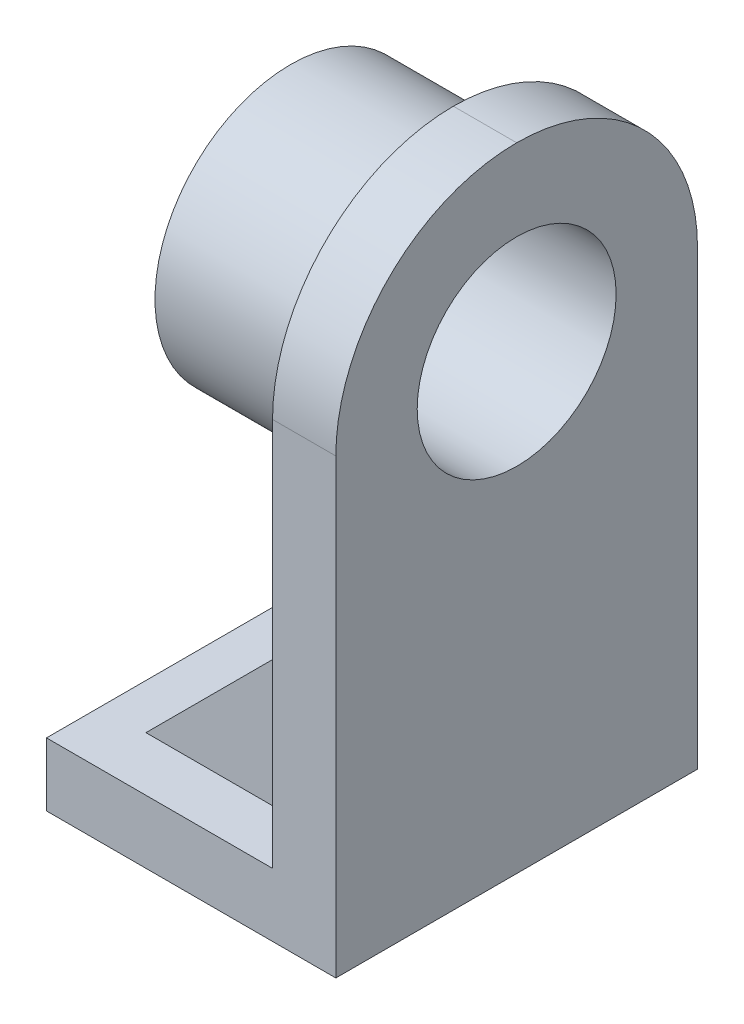
ISO-10303-21;
HEADER;
FILE_DESCRIPTION(('STEP AP214'),'2;1');
FILE_NAME('part.step','',(''),(''),'','','');
FILE_SCHEMA(('AUTOMOTIVE_DESIGN { 1 0 10303 214 1 1 1 1 }'));
ENDSEC;
DATA;
#1=APPLICATION_CONTEXT('core data for automotive mechanical design processes');
#2=APPLICATION_PROTOCOL_DEFINITION('international standard','automotive_design',2000,#1);
#3=PRODUCT_CONTEXT('',#1,'mechanical');
#4=PRODUCT('Part','Part','',(#3));
#5=PRODUCT_RELATED_PRODUCT_CATEGORY('part','',(#4));
#6=PRODUCT_DEFINITION_FORMATION('','',#4);
#7=PRODUCT_DEFINITION_CONTEXT('part definition',#1,'design');
#8=PRODUCT_DEFINITION('design','',#6,#7);
#9=PRODUCT_DEFINITION_SHAPE('','',#8);
#10=(LENGTH_UNIT() NAMED_UNIT(*) SI_UNIT(.MILLI.,.METRE.));
#11=(NAMED_UNIT(*) PLANE_ANGLE_UNIT() SI_UNIT($,.RADIAN.));
#12=(NAMED_UNIT(*) SI_UNIT($,.STERADIAN.) SOLID_ANGLE_UNIT());
#13=UNCERTAINTY_MEASURE_WITH_UNIT(LENGTH_MEASURE(1.E-05),#10,'distance_accuracy_value','');
#14=(GEOMETRIC_REPRESENTATION_CONTEXT(3) GLOBAL_UNCERTAINTY_ASSIGNED_CONTEXT((#13)) GLOBAL_UNIT_ASSIGNED_CONTEXT((#10,
#11,#12)) REPRESENTATION_CONTEXT('',''));
#15=CARTESIAN_POINT('',(0.,0.,0.));
#16=DIRECTION('',(0.,0.,1.));
#17=DIRECTION('',(1.,0.,0.));
#18=AXIS2_PLACEMENT_3D('',#15,#16,#17);
#19=CARTESIAN_POINT('',(-27.,7.,-30.));
#20=DIRECTION('',(-0.707106781186548,0.707106781186548,0.));
#21=DIRECTION('',(-0.707106781186548,-0.707106781186548,0.));
#22=AXIS2_PLACEMENT_3D('',#19,#20,#21);
#23=PLANE('',#22);
#24=DIRECTION('',(0.,0.,-1.));
#25=VECTOR('',#24,1.);
#26=CARTESIAN_POINT('',(-7.,27.,-30.));
#27=LINE('',#26,#25);
#28=CARTESIAN_POINT('',(-7.,27.,-30.));
#29=VERTEX_POINT('',#28);
#30=CARTESIAN_POINT('',(-7.,27.,-34.));
#31=VERTEX_POINT('',#30);
#32=EDGE_CURVE('E158',#29,#31,#27,.T.);
#33=ORIENTED_EDGE('',*,*,#32,.T.);
#34=DIRECTION('',(0.707106781186548,0.707106781186548,0.));
#35=VECTOR('',#34,1.);
#36=CARTESIAN_POINT('',(-7.,27.,-34.));
#37=LINE('',#36,#35);
#38=CARTESIAN_POINT('',(-27.,7.,-34.));
#39=VERTEX_POINT('',#38);
#40=EDGE_CURVE('E138',#39,#31,#37,.T.);
#41=ORIENTED_EDGE('',*,*,#40,.F.);
#42=DIRECTION('',(0.,0.,-1.));
#43=VECTOR('',#42,1.);
#44=CARTESIAN_POINT('',(-27.,7.,-30.));
#45=LINE('',#44,#43);
#46=CARTESIAN_POINT('',(-27.,7.,-30.));
#47=VERTEX_POINT('',#46);
#48=EDGE_CURVE('E141',#47,#39,#45,.T.);
#49=ORIENTED_EDGE('',*,*,#48,.F.);
#50=DIRECTION('',(0.707106781186548,0.707106781186548,0.));
#51=VECTOR('',#50,1.);
#52=CARTESIAN_POINT('',(-27.,7.,-30.));
#53=LINE('',#52,#51);
#54=EDGE_CURVE('E137',#47,#29,#53,.T.);
#55=ORIENTED_EDGE('',*,*,#54,.T.);
#56=EDGE_LOOP('',(#33,#41,#49,#55));
#57=FACE_BOUND('',#56,.T.);
#58=ADVANCED_FACE('F33',(#57),#23,.T.);
#59=CARTESIAN_POINT('',(-32.,7.,-40.));
#60=DIRECTION('',(0.,1.,0.));
#61=DIRECTION('',(0.,0.,1.));
#62=AXIS2_PLACEMENT_3D('',#59,#60,#61);
#63=PLANE('',#62);
#64=ORIENTED_EDGE('',*,*,#48,.T.);
#65=DIRECTION('',(-1.,0.,0.));
#66=VECTOR('',#65,1.);
#67=CARTESIAN_POINT('',(-27.,7.,-34.));
#68=LINE('',#67,#66);
#69=CARTESIAN_POINT('',(-7.,7.,-34.));
#70=VERTEX_POINT('',#69);
#71=EDGE_CURVE('E49',#70,#39,#68,.T.);
#72=ORIENTED_EDGE('',*,*,#71,.F.);
#73=DIRECTION('',(0.,0.,-1.));
#74=VECTOR('',#73,1.);
#75=CARTESIAN_POINT('',(-7.,7.,-34.));
#76=LINE('',#75,#74);
#77=CARTESIAN_POINT('',(-7.,7.,-40.));
#78=VERTEX_POINT('',#77);
#79=EDGE_CURVE('E131',#70,#78,#76,.T.);
#80=ORIENTED_EDGE('',*,*,#79,.T.);
#81=DIRECTION('',(-1.,0.,0.));
#82=VECTOR('',#81,1.);
#83=CARTESIAN_POINT('',(-32.,7.,-40.));
#84=LINE('',#83,#82);
#85=CARTESIAN_POINT('',(-32.,7.,-40.));
#86=VERTEX_POINT('',#85);
#87=EDGE_CURVE('E191',#78,#86,#84,.T.);
#88=ORIENTED_EDGE('',*,*,#87,.T.);
#89=DIRECTION('',(0.,0.,1.));
#90=VECTOR('',#89,1.);
#91=CARTESIAN_POINT('',(-32.,7.,-40.));
#92=LINE('',#91,#90);
#93=CARTESIAN_POINT('',(-32.,7.,0.));
#94=VERTEX_POINT('',#93);
#95=EDGE_CURVE('E217',#86,#94,#92,.T.);
#96=ORIENTED_EDGE('',*,*,#95,.T.);
#97=DIRECTION('',(-1.,0.,0.));
#98=VECTOR('',#97,1.);
#99=CARTESIAN_POINT('',(-32.,7.,0.));
#100=LINE('',#99,#98);
#101=CARTESIAN_POINT('',(-7.,7.,0.));
#102=VERTEX_POINT('',#101);
#103=EDGE_CURVE('E205',#102,#94,#100,.T.);
#104=ORIENTED_EDGE('',*,*,#103,.F.);
#105=DIRECTION('',(0.,0.,1.));
#106=VECTOR('',#105,1.);
#107=CARTESIAN_POINT('',(-7.,7.,-6.));
#108=LINE('',#107,#106);
#109=CARTESIAN_POINT('',(-7.,7.,-6.));
#110=VERTEX_POINT('',#109);
#111=EDGE_CURVE('E169',#110,#102,#108,.T.);
#112=ORIENTED_EDGE('',*,*,#111,.F.);
#113=DIRECTION('',(1.,0.,0.));
#114=VECTOR('',#113,1.);
#115=CARTESIAN_POINT('',(-7.,7.,-6.));
#116=LINE('',#115,#114);
#117=CARTESIAN_POINT('',(-27.,7.,-6.));
#118=VERTEX_POINT('',#117);
#119=EDGE_CURVE('E164',#118,#110,#116,.T.);
#120=ORIENTED_EDGE('',*,*,#119,.F.);
#121=DIRECTION('',(0.,0.,1.));
#122=VECTOR('',#121,1.);
#123=CARTESIAN_POINT('',(-27.,7.,-10.));
#124=LINE('',#123,#122);
#125=CARTESIAN_POINT('',(-27.,7.,-10.));
#126=VERTEX_POINT('',#125);
#127=EDGE_CURVE('E183',#126,#118,#124,.T.);
#128=ORIENTED_EDGE('',*,*,#127,.F.);
#129=DIRECTION('',(-1.,0.,0.));
#130=VECTOR('',#129,1.);
#131=CARTESIAN_POINT('',(-7.,7.,-10.));
#132=LINE('',#131,#130);
#133=CARTESIAN_POINT('',(-7.,7.,-10.));
#134=VERTEX_POINT('',#133);
#135=EDGE_CURVE('E172',#134,#126,#132,.T.);
#136=ORIENTED_EDGE('',*,*,#135,.F.);
#137=DIRECTION('',(0.,0.,1.));
#138=VECTOR('',#137,1.);
#139=CARTESIAN_POINT('',(-7.,7.,-40.));
#140=LINE('',#139,#138);
#141=CARTESIAN_POINT('',(-7.,7.,-30.));
#142=VERTEX_POINT('',#141);
#143=EDGE_CURVE('E199',#142,#134,#140,.T.);
#144=ORIENTED_EDGE('',*,*,#143,.F.);
#145=DIRECTION('',(-1.,0.,0.));
#146=VECTOR('',#145,1.);
#147=CARTESIAN_POINT('',(-7.,7.,-30.));
#148=LINE('',#147,#146);
#149=EDGE_CURVE('E57',#142,#47,#148,.T.);
#150=ORIENTED_EDGE('',*,*,#149,.T.);
#151=EDGE_LOOP('',(#64,#72,#80,#88,#96,#104,#112,#120,#128,#136,#144,#150));
#152=FACE_BOUND('',#151,.T.);
#153=ADVANCED_FACE('F140',(#152),#63,.T.);
#154=CARTESIAN_POINT('',(-7.,7.,-40.));
#155=DIRECTION('',(-1.,0.,0.));
#156=DIRECTION('',(0.,-1.,0.));
#157=AXIS2_PLACEMENT_3D('',#154,#155,#156);
#158=PLANE('',#157);
#159=CARTESIAN_POINT('',(-7.,50.,-20.));
#160=DIRECTION('',(-1.,0.,0.));
#161=DIRECTION('',(0.,-1.,0.));
#162=AXIS2_PLACEMENT_3D('',#159,#160,#161);
#163=CIRCLE('',#162,15.);
#164=CARTESIAN_POINT('',(-7.,35.,-20.));
#165=VERTEX_POINT('',#164);
#166=EDGE_CURVE('E148',#165,#165,#163,.T.);
#167=ORIENTED_EDGE('',*,*,#166,.F.);
#168=EDGE_LOOP('',(#167));
#169=FACE_BOUND('',#168,.T.);
#170=ORIENTED_EDGE('',*,*,#32,.F.);
#171=DIRECTION('',(0.,-1.,0.));
#172=VECTOR('',#171,1.);
#173=CARTESIAN_POINT('',(-7.,27.,-30.));
#174=LINE('',#173,#172);
#175=EDGE_CURVE('E155',#29,#142,#174,.T.);
#176=ORIENTED_EDGE('',*,*,#175,.T.);
#177=ORIENTED_EDGE('',*,*,#143,.T.);
#178=DIRECTION('',(0.,-1.,0.));
#179=VECTOR('',#178,1.);
#180=CARTESIAN_POINT('',(-7.,27.,-10.));
#181=LINE('',#180,#179);
#182=CARTESIAN_POINT('',(-7.,27.,-10.));
#183=VERTEX_POINT('',#182);
#184=EDGE_CURVE('E177',#183,#134,#181,.T.);
#185=ORIENTED_EDGE('',*,*,#184,.F.);
#186=DIRECTION('',(0.,0.,1.));
#187=VECTOR('',#186,1.);
#188=CARTESIAN_POINT('',(-7.,27.,-10.));
#189=LINE('',#188,#187);
#190=CARTESIAN_POINT('',(-7.,27.,-6.));
#191=VERTEX_POINT('',#190);
#192=EDGE_CURVE('E180',#183,#191,#189,.T.);
#193=ORIENTED_EDGE('',*,*,#192,.T.);
#194=DIRECTION('',(0.,1.,0.));
#195=VECTOR('',#194,1.);
#196=CARTESIAN_POINT('',(-7.,27.,-6.));
#197=LINE('',#196,#195);
#198=EDGE_CURVE('E167',#110,#191,#197,.T.);
#199=ORIENTED_EDGE('',*,*,#198,.F.);
#200=ORIENTED_EDGE('',*,*,#111,.T.);
#201=DIRECTION('',(0.,-1.,0.));
#202=VECTOR('',#201,1.);
#203=CARTESIAN_POINT('',(-7.,7.,0.));
#204=LINE('',#203,#202);
#205=CARTESIAN_POINT('',(-7.,50.,0.));
#206=VERTEX_POINT('',#205);
#207=EDGE_CURVE('E203',#206,#102,#204,.T.);
#208=ORIENTED_EDGE('',*,*,#207,.F.);
#209=CARTESIAN_POINT('',(-7.,50.,-20.));
#210=DIRECTION('',(-1.,0.,0.));
#211=DIRECTION('',(0.,-1.,0.));
#212=AXIS2_PLACEMENT_3D('',#209,#210,#211);
#213=CIRCLE('',#212,20.);
#214=CARTESIAN_POINT('',(-7.,70.,-20.));
#215=VERTEX_POINT('',#214);
#216=EDGE_CURVE('E225',#206,#215,#213,.T.);
#217=ORIENTED_EDGE('',*,*,#216,.T.);
#218=CARTESIAN_POINT('',(-7.,50.,-20.));
#219=DIRECTION('',(-1.,0.,0.));
#220=DIRECTION('',(0.,-1.,0.));
#221=AXIS2_PLACEMENT_3D('',#218,#219,#220);
#222=CIRCLE('',#221,20.);
#223=CARTESIAN_POINT('',(-7.,50.,-40.));
#224=VERTEX_POINT('',#223);
#225=EDGE_CURVE('E223',#215,#224,#222,.T.);
#226=ORIENTED_EDGE('',*,*,#225,.T.);
#227=DIRECTION('',(0.,-1.,0.));
#228=VECTOR('',#227,1.);
#229=CARTESIAN_POINT('',(-7.,7.,-40.));
#230=LINE('',#229,#228);
#231=EDGE_CURVE('E135',#224,#78,#230,.T.);
#232=ORIENTED_EDGE('',*,*,#231,.T.);
#233=ORIENTED_EDGE('',*,*,#79,.F.);
#234=DIRECTION('',(0.,-1.,0.));
#235=VECTOR('',#234,1.);
#236=CARTESIAN_POINT('',(-7.,7.,-34.));
#237=LINE('',#236,#235);
#238=EDGE_CURVE('E133',#31,#70,#237,.T.);
#239=ORIENTED_EDGE('',*,*,#238,.F.);
#240=EDGE_LOOP('',(#170,#176,#177,#185,#193,#199,#200,#208,#217,#226,#232,#233,#239));
#241=FACE_BOUND('',#240,.T.);
#242=ADVANCED_FACE('F132',(#169,#241),#158,.T.);
#243=CARTESIAN_POINT('',(0.,0.,-40.));
#244=DIRECTION('',(1.,0.,0.));
#245=DIRECTION('',(0.,0.,-1.));
#246=AXIS2_PLACEMENT_3D('',#243,#244,#245);
#247=PLANE('',#246);
#248=CARTESIAN_POINT('',(0.,50.,-20.));
#249=DIRECTION('',(-1.,0.,0.));
#250=DIRECTION('',(0.,-1.,0.));
#251=AXIS2_PLACEMENT_3D('',#248,#249,#250);
#252=CIRCLE('',#251,11.);
#253=CARTESIAN_POINT('',(0.,39.,-20.));
#254=VERTEX_POINT('',#253);
#255=EDGE_CURVE('E452',#254,#254,#252,.T.);
#256=ORIENTED_EDGE('',*,*,#255,.T.);
#257=EDGE_LOOP('',(#256));
#258=FACE_BOUND('',#257,.T.);
#259=CARTESIAN_POINT('',(0.,50.,-20.));
#260=DIRECTION('',(1.,0.,0.));
#261=DIRECTION('',(0.,0.,-1.));
#262=AXIS2_PLACEMENT_3D('',#259,#260,#261);
#263=CIRCLE('',#262,20.);
#264=CARTESIAN_POINT('',(0.,50.,-40.));
#265=VERTEX_POINT('',#264);
#266=CARTESIAN_POINT('',(0.,70.,-20.));
#267=VERTEX_POINT('',#266);
#268=EDGE_CURVE('E227',#265,#267,#263,.T.);
#269=ORIENTED_EDGE('',*,*,#268,.T.);
#270=CARTESIAN_POINT('',(0.,50.,-20.));
#271=DIRECTION('',(1.,0.,0.));
#272=DIRECTION('',(0.,0.,-1.));
#273=AXIS2_PLACEMENT_3D('',#270,#271,#272);
#274=CIRCLE('',#273,20.);
#275=CARTESIAN_POINT('',(0.,50.,0.));
#276=VERTEX_POINT('',#275);
#277=EDGE_CURVE('E42',#267,#276,#274,.T.);
#278=ORIENTED_EDGE('',*,*,#277,.T.);
#279=DIRECTION('',(0.,1.,0.));
#280=VECTOR('',#279,1.);
#281=CARTESIAN_POINT('',(0.,0.,0.));
#282=LINE('',#281,#280);
#283=CARTESIAN_POINT('',(0.,0.,0.));
#284=VERTEX_POINT('',#283);
#285=EDGE_CURVE('E200',#284,#276,#282,.T.);
#286=ORIENTED_EDGE('',*,*,#285,.F.);
#287=DIRECTION('',(0.,0.,1.));
#288=VECTOR('',#287,1.);
#289=CARTESIAN_POINT('',(0.,0.,-40.));
#290=LINE('',#289,#288);
#291=CARTESIAN_POINT('',(0.,0.,-40.));
#292=VERTEX_POINT('',#291);
#293=EDGE_CURVE('E212',#292,#284,#290,.T.);
#294=ORIENTED_EDGE('',*,*,#293,.F.);
#295=DIRECTION('',(0.,1.,0.));
#296=VECTOR('',#295,1.);
#297=CARTESIAN_POINT('',(0.,0.,-40.));
#298=LINE('',#297,#296);
#299=EDGE_CURVE('E186',#292,#265,#298,.T.);
#300=ORIENTED_EDGE('',*,*,#299,.T.);
#301=EDGE_LOOP('',(#269,#278,#286,#294,#300));
#302=FACE_BOUND('',#301,.T.);
#303=ADVANCED_FACE('F232',(#258,#302),#247,.T.);
#304=CARTESIAN_POINT('',(0.,0.,-40.));
#305=DIRECTION('',(0.,-1.,0.));
#306=DIRECTION('',(0.,0.,-1.));
#307=AXIS2_PLACEMENT_3D('',#304,#305,#306);
#308=PLANE('',#307);
#309=DIRECTION('',(1.,0.,0.));
#310=VECTOR('',#309,1.);
#311=CARTESIAN_POINT('',(0.,0.,0.));
#312=LINE('',#311,#310);
#313=CARTESIAN_POINT('',(-32.,0.,0.));
#314=VERTEX_POINT('',#313);
#315=EDGE_CURVE('E189',#314,#284,#312,.T.);
#316=ORIENTED_EDGE('',*,*,#315,.F.);
#317=DIRECTION('',(0.,0.,1.));
#318=VECTOR('',#317,1.);
#319=CARTESIAN_POINT('',(-32.,0.,-40.));
#320=LINE('',#319,#318);
#321=CARTESIAN_POINT('',(-32.,0.,-40.));
#322=VERTEX_POINT('',#321);
#323=EDGE_CURVE('E215',#322,#314,#320,.T.);
#324=ORIENTED_EDGE('',*,*,#323,.F.);
#325=DIRECTION('',(1.,0.,0.));
#326=VECTOR('',#325,1.);
#327=CARTESIAN_POINT('',(0.,0.,-40.));
#328=LINE('',#327,#326);
#329=EDGE_CURVE('E196',#322,#292,#328,.T.);
#330=ORIENTED_EDGE('',*,*,#329,.T.);
#331=ORIENTED_EDGE('',*,*,#293,.T.);
#332=EDGE_LOOP('',(#316,#324,#330,#331));
#333=FACE_BOUND('',#332,.T.);
#334=ADVANCED_FACE('F251',(#333),#308,.T.);
#335=CARTESIAN_POINT('',(-32.,0.,-40.));
#336=DIRECTION('',(-1.,0.,0.));
#337=DIRECTION('',(0.,0.,1.));
#338=AXIS2_PLACEMENT_3D('',#335,#336,#337);
#339=PLANE('',#338);
#340=DIRECTION('',(0.,-1.,0.));
#341=VECTOR('',#340,1.);
#342=CARTESIAN_POINT('',(-32.,0.,0.));
#343=LINE('',#342,#341);
#344=EDGE_CURVE('E207',#94,#314,#343,.T.);
#345=ORIENTED_EDGE('',*,*,#344,.F.);
#346=ORIENTED_EDGE('',*,*,#95,.F.);
#347=DIRECTION('',(0.,-1.,0.));
#348=VECTOR('',#347,1.);
#349=CARTESIAN_POINT('',(-32.,0.,-40.));
#350=LINE('',#349,#348);
#351=EDGE_CURVE('E193',#86,#322,#350,.T.);
#352=ORIENTED_EDGE('',*,*,#351,.T.);
#353=ORIENTED_EDGE('',*,*,#323,.T.);
#354=EDGE_LOOP('',(#345,#346,#352,#353));
#355=FACE_BOUND('',#354,.T.);
#356=ADVANCED_FACE('F256',(#355),#339,.T.);
#357=CARTESIAN_POINT('',(0.,0.,-40.));
#358=DIRECTION('',(0.,0.,-1.));
#359=DIRECTION('',(-1.,0.,0.));
#360=AXIS2_PLACEMENT_3D('',#357,#358,#359);
#361=PLANE('',#360);
#362=ORIENTED_EDGE('',*,*,#87,.F.);
#363=ORIENTED_EDGE('',*,*,#231,.F.);
#364=DIRECTION('',(-1.,0.,0.));
#365=VECTOR('',#364,1.);
#366=CARTESIAN_POINT('',(0.,50.,-40.));
#367=LINE('',#366,#365);
#368=EDGE_CURVE('E11',#224,#265,#367,.F.);
#369=ORIENTED_EDGE('',*,*,#368,.T.);
#370=ORIENTED_EDGE('',*,*,#299,.F.);
#371=ORIENTED_EDGE('',*,*,#329,.F.);
#372=ORIENTED_EDGE('',*,*,#351,.F.);
#373=EDGE_LOOP('',(#362,#363,#369,#370,#371,#372));
#374=FACE_BOUND('',#373,.T.);
#375=ADVANCED_FACE('F248',(#374),#361,.T.);
#376=CARTESIAN_POINT('',(0.,0.,0.));
#377=DIRECTION('',(0.,0.,-1.));
#378=DIRECTION('',(-1.,0.,0.));
#379=AXIS2_PLACEMENT_3D('',#376,#377,#378);
#380=PLANE('',#379);
#381=ORIENTED_EDGE('',*,*,#207,.T.);
#382=ORIENTED_EDGE('',*,*,#103,.T.);
#383=ORIENTED_EDGE('',*,*,#344,.T.);
#384=ORIENTED_EDGE('',*,*,#315,.T.);
#385=ORIENTED_EDGE('',*,*,#285,.T.);
#386=DIRECTION('',(-1.,0.,0.));
#387=VECTOR('',#386,1.);
#388=CARTESIAN_POINT('',(-7.,50.,0.));
#389=LINE('',#388,#387);
#390=EDGE_CURVE('E214',#276,#206,#389,.T.);
#391=ORIENTED_EDGE('',*,*,#390,.T.);
#392=EDGE_LOOP('',(#381,#382,#383,#384,#385,#391));
#393=FACE_BOUND('',#392,.T.);
#394=ADVANCED_FACE('F239',(#393),#380,.F.);
#395=CARTESIAN_POINT('',(-7.,50.,-20.));
#396=DIRECTION('',(-1.,0.,0.));
#397=DIRECTION('',(0.,0.,1.));
#398=AXIS2_PLACEMENT_3D('',#395,#396,#397);
#399=CYLINDRICAL_SURFACE('',#398,20.);
#400=DIRECTION('',(-1.,0.,0.));
#401=VECTOR('',#400,1.);
#402=CARTESIAN_POINT('',(-7.,70.,-20.));
#403=LINE('',#402,#401);
#404=EDGE_CURVE('E37',#267,#215,#403,.T.);
#405=ORIENTED_EDGE('',*,*,#404,.F.);
#406=ORIENTED_EDGE('',*,*,#268,.F.);
#407=ORIENTED_EDGE('',*,*,#368,.F.);
#408=ORIENTED_EDGE('',*,*,#225,.F.);
#409=EDGE_LOOP('',(#405,#406,#407,#408));
#410=FACE_BOUND('',#409,.T.);
#411=ADVANCED_FACE('F35',(#410),#399,.T.);
#412=CARTESIAN_POINT('',(0.,50.,-20.));
#413=DIRECTION('',(1.,0.,0.));
#414=DIRECTION('',(0.,0.,-1.));
#415=AXIS2_PLACEMENT_3D('',#412,#413,#414);
#416=CYLINDRICAL_SURFACE('',#415,20.);
#417=ORIENTED_EDGE('',*,*,#277,.F.);
#418=ORIENTED_EDGE('',*,*,#404,.T.);
#419=ORIENTED_EDGE('',*,*,#216,.F.);
#420=ORIENTED_EDGE('',*,*,#390,.F.);
#421=EDGE_LOOP('',(#417,#418,#419,#420));
#422=FACE_BOUND('',#421,.T.);
#423=ADVANCED_FACE('F242',(#422),#416,.T.);
#424=CARTESIAN_POINT('',(-27.,7.,-10.));
#425=DIRECTION('',(0.707106781186548,-0.707106781186548,0.));
#426=DIRECTION('',(0.707106781186548,0.707106781186548,0.));
#427=AXIS2_PLACEMENT_3D('',#424,#425,#426);
#428=PLANE('',#427);
#429=ORIENTED_EDGE('',*,*,#127,.T.);
#430=DIRECTION('',(-0.707106781186548,-0.707106781186548,0.));
#431=VECTOR('',#430,1.);
#432=CARTESIAN_POINT('',(-27.,7.,-6.));
#433=LINE('',#432,#431);
#434=EDGE_CURVE('E160',#191,#118,#433,.T.);
#435=ORIENTED_EDGE('',*,*,#434,.F.);
#436=ORIENTED_EDGE('',*,*,#192,.F.);
#437=DIRECTION('',(0.707106781186548,0.707106781186548,0.));
#438=VECTOR('',#437,1.);
#439=CARTESIAN_POINT('',(-27.,7.,-10.));
#440=LINE('',#439,#438);
#441=EDGE_CURVE('E175',#126,#183,#440,.T.);
#442=ORIENTED_EDGE('',*,*,#441,.F.);
#443=EDGE_LOOP('',(#429,#435,#436,#442));
#444=FACE_BOUND('',#443,.T.);
#445=ADVANCED_FACE('F265',(#444),#428,.F.);
#446=CARTESIAN_POINT('',(0.,0.,-10.));
#447=DIRECTION('',(0.,0.,1.));
#448=DIRECTION('',(1.,0.,0.));
#449=AXIS2_PLACEMENT_3D('',#446,#447,#448);
#450=PLANE('',#449);
#451=ORIENTED_EDGE('',*,*,#135,.T.);
#452=ORIENTED_EDGE('',*,*,#441,.T.);
#453=ORIENTED_EDGE('',*,*,#184,.T.);
#454=EDGE_LOOP('',(#451,#452,#453));
#455=FACE_BOUND('',#454,.T.);
#456=ADVANCED_FACE('F269',(#455),#450,.F.);
#457=CARTESIAN_POINT('',(0.,0.,-6.));
#458=DIRECTION('',(0.,0.,-1.));
#459=DIRECTION('',(-1.,0.,0.));
#460=AXIS2_PLACEMENT_3D('',#457,#458,#459);
#461=PLANE('',#460);
#462=ORIENTED_EDGE('',*,*,#434,.T.);
#463=ORIENTED_EDGE('',*,*,#119,.T.);
#464=ORIENTED_EDGE('',*,*,#198,.T.);
#465=EDGE_LOOP('',(#462,#463,#464));
#466=FACE_BOUND('',#465,.T.);
#467=ADVANCED_FACE('F263',(#466),#461,.F.);
#468=CARTESIAN_POINT('',(0.,0.,-30.));
#469=DIRECTION('',(0.,0.,-1.));
#470=DIRECTION('',(-1.,0.,0.));
#471=AXIS2_PLACEMENT_3D('',#468,#469,#470);
#472=PLANE('',#471);
#473=ORIENTED_EDGE('',*,*,#54,.F.);
#474=ORIENTED_EDGE('',*,*,#149,.F.);
#475=ORIENTED_EDGE('',*,*,#175,.F.);
#476=EDGE_LOOP('',(#473,#474,#475));
#477=FACE_BOUND('',#476,.T.);
#478=ADVANCED_FACE('F273',(#477),#472,.F.);
#479=CARTESIAN_POINT('',(0.,0.,-34.));
#480=DIRECTION('',(0.,0.,-1.));
#481=DIRECTION('',(-1.,0.,0.));
#482=AXIS2_PLACEMENT_3D('',#479,#480,#481);
#483=PLANE('',#482);
#484=ORIENTED_EDGE('',*,*,#238,.T.);
#485=ORIENTED_EDGE('',*,*,#71,.T.);
#486=ORIENTED_EDGE('',*,*,#40,.T.);
#487=EDGE_LOOP('',(#484,#485,#486));
#488=FACE_BOUND('',#487,.T.);
#489=ADVANCED_FACE('F143',(#488),#483,.T.);
#490=CARTESIAN_POINT('',(-25.,50.,-20.));
#491=DIRECTION('',(-1.,0.,0.));
#492=DIRECTION('',(0.,-1.,0.));
#493=AXIS2_PLACEMENT_3D('',#490,#491,#492);
#494=PLANE('',#493);
#495=CARTESIAN_POINT('',(-25.,50.,-20.));
#496=DIRECTION('',(-1.,0.,0.));
#497=DIRECTION('',(0.,-1.,0.));
#498=AXIS2_PLACEMENT_3D('',#495,#496,#497);
#499=CIRCLE('',#498,15.);
#500=CARTESIAN_POINT('',(-25.,35.,-20.));
#501=VERTEX_POINT('',#500);
#502=EDGE_CURVE('E145',#501,#501,#499,.T.);
#503=ORIENTED_EDGE('',*,*,#502,.T.);
#504=EDGE_LOOP('',(#503));
#505=FACE_BOUND('',#504,.T.);
#506=CARTESIAN_POINT('',(-25.,50.,-20.));
#507=DIRECTION('',(-1.,0.,0.));
#508=DIRECTION('',(0.,-1.,0.));
#509=AXIS2_PLACEMENT_3D('',#506,#507,#508);
#510=CIRCLE('',#509,11.);
#511=CARTESIAN_POINT('',(-25.,39.,-20.));
#512=VERTEX_POINT('',#511);
#513=EDGE_CURVE('E449',#512,#512,#510,.T.);
#514=ORIENTED_EDGE('',*,*,#513,.F.);
#515=EDGE_LOOP('',(#514));
#516=FACE_BOUND('',#515,.T.);
#517=ADVANCED_FACE('F415',(#505,#516),#494,.T.);
#518=CARTESIAN_POINT('',(-25.,50.,-20.));
#519=DIRECTION('',(1.,0.,0.));
#520=DIRECTION('',(0.,1.,0.));
#521=AXIS2_PLACEMENT_3D('',#518,#519,#520);
#522=CYLINDRICAL_SURFACE('',#521,15.);
#523=ORIENTED_EDGE('',*,*,#502,.F.);
#524=EDGE_LOOP('',(#523));
#525=FACE_BOUND('',#524,.T.);
#526=ORIENTED_EDGE('',*,*,#166,.T.);
#527=EDGE_LOOP('',(#526));
#528=FACE_BOUND('',#527,.T.);
#529=ADVANCED_FACE('F421',(#525,#528),#522,.T.);
#530=CARTESIAN_POINT('',(-25.,50.,-20.));
#531=DIRECTION('',(1.,0.,0.));
#532=DIRECTION('',(0.,1.,0.));
#533=AXIS2_PLACEMENT_3D('',#530,#531,#532);
#534=CYLINDRICAL_SURFACE('',#533,11.);
#535=ORIENTED_EDGE('',*,*,#513,.T.);
#536=EDGE_LOOP('',(#535));
#537=FACE_BOUND('',#536,.T.);
#538=ORIENTED_EDGE('',*,*,#255,.F.);
#539=EDGE_LOOP('',(#538));
#540=FACE_BOUND('',#539,.T.);
#541=ADVANCED_FACE('F429',(#537,#540),#534,.F.);
#542=CLOSED_SHELL('',(#58,#153,#242,#303,#334,#356,#375,#394,#411,#423,#445,#456,#467,#478,#489,
#517,#529,#541));
#543=MANIFOLD_SOLID_BREP('B2',#542);
#544=ADVANCED_BREP_SHAPE_REPRESENTATION('',(#18,#543),#14);
#545=SHAPE_DEFINITION_REPRESENTATION(#9,#544);
ENDSEC;
END-ISO-10303-21;
